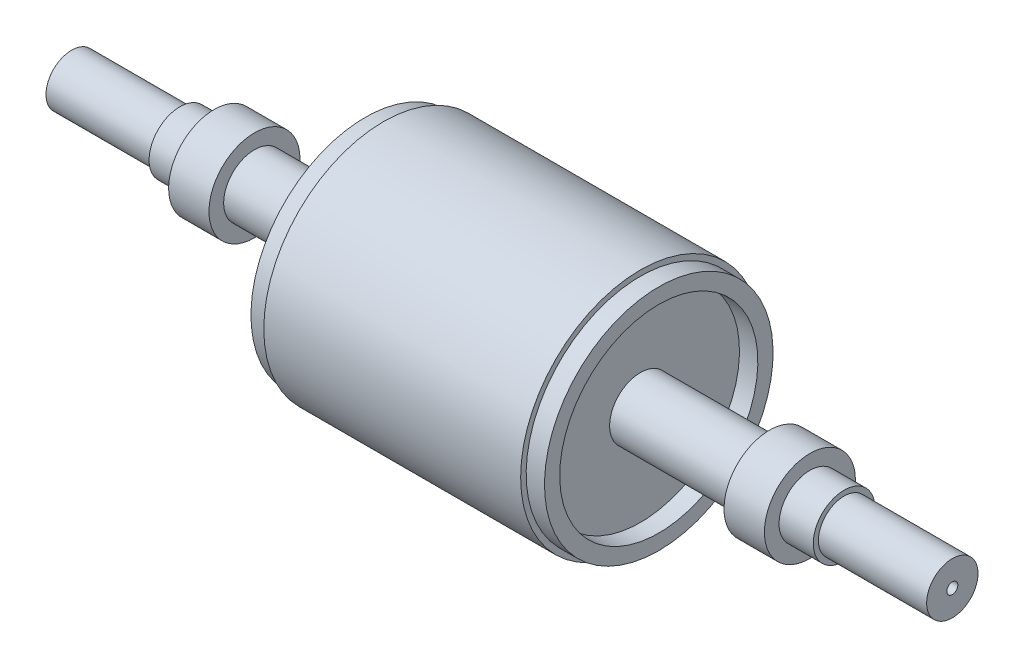
ISO-10303-21;
HEADER;
FILE_DESCRIPTION(('STEP AP214'),'2;1');
FILE_NAME('part.step','',(''),(''),'','','');
FILE_SCHEMA(('AUTOMOTIVE_DESIGN { 1 0 10303 214 1 1 1 1 }'));
ENDSEC;
DATA;
#1=APPLICATION_CONTEXT('core data for automotive mechanical design processes');
#2=APPLICATION_PROTOCOL_DEFINITION('international standard','automotive_design',2000,#1);
#3=PRODUCT_CONTEXT('',#1,'mechanical');
#4=PRODUCT('Part','Part','',(#3));
#5=PRODUCT_RELATED_PRODUCT_CATEGORY('part','',(#4));
#6=PRODUCT_DEFINITION_FORMATION('','',#4);
#7=PRODUCT_DEFINITION_CONTEXT('part definition',#1,'design');
#8=PRODUCT_DEFINITION('design','',#6,#7);
#9=PRODUCT_DEFINITION_SHAPE('','',#8);
#10=(LENGTH_UNIT() NAMED_UNIT(*) SI_UNIT(.MILLI.,.METRE.));
#11=(NAMED_UNIT(*) PLANE_ANGLE_UNIT() SI_UNIT($,.RADIAN.));
#12=(NAMED_UNIT(*) SI_UNIT($,.STERADIAN.) SOLID_ANGLE_UNIT());
#13=UNCERTAINTY_MEASURE_WITH_UNIT(LENGTH_MEASURE(1.E-05),#10,'distance_accuracy_value','');
#14=(GEOMETRIC_REPRESENTATION_CONTEXT(3) GLOBAL_UNCERTAINTY_ASSIGNED_CONTEXT((#13)) GLOBAL_UNIT_ASSIGNED_CONTEXT((#10,
#11,#12)) REPRESENTATION_CONTEXT('',''));
#15=CARTESIAN_POINT('',(0.,0.,0.));
#16=DIRECTION('',(0.,0.,1.));
#17=DIRECTION('',(1.,0.,0.));
#18=AXIS2_PLACEMENT_3D('',#15,#16,#17);
#19=CARTESIAN_POINT('',(95.4752231560291,0.,0.));
#20=DIRECTION('',(1.,0.,0.));
#21=DIRECTION('',(0.,1.,0.));
#22=AXIS2_PLACEMENT_3D('',#19,#20,#21);
#23=PLANE('',#22);
#24=CARTESIAN_POINT('',(95.4752231560291,-22.6944256888028,0.));
#25=DIRECTION('',(1.,0.,0.));
#26=DIRECTION('',(0.,1.,0.));
#27=AXIS2_PLACEMENT_3D('',#24,#25,#26);
#28=CIRCLE('',#27,27.);
#29=CARTESIAN_POINT('',(95.4752231560291,4.30557431119716,0.));
#30=VERTEX_POINT('',#29);
#31=EDGE_CURVE('E116',#30,#30,#28,.T.);
#32=ORIENTED_EDGE('',*,*,#31,.F.);
#33=EDGE_LOOP('',(#32));
#34=FACE_BOUND('',#33,.T.);
#35=CARTESIAN_POINT('',(95.4752231560291,-22.6944256888028,0.));
#36=DIRECTION('',(-1.,0.,0.));
#37=DIRECTION('',(0.,-1.,0.));
#38=AXIS2_PLACEMENT_3D('',#35,#36,#37);
#39=CIRCLE('',#38,31.1522029158007);
#40=CARTESIAN_POINT('',(95.4752231560291,-53.8466286046036,0.));
#41=VERTEX_POINT('',#40);
#42=EDGE_CURVE('E53',#41,#41,#39,.T.);
#43=ORIENTED_EDGE('',*,*,#42,.F.);
#44=EDGE_LOOP('',(#43));
#45=FACE_BOUND('',#44,.T.);
#46=ADVANCED_FACE('F38',(#34,#45),#23,.T.);
#47=CARTESIAN_POINT('',(95.4752231560291,-22.6944256888028,0.));
#48=DIRECTION('',(1.,0.,0.));
#49=DIRECTION('',(0.,1.,0.));
#50=AXIS2_PLACEMENT_3D('',#47,#48,#49);
#51=CONICAL_SURFACE('',#50,31.1522029158007,0.00169796264531494);
#52=CARTESIAN_POINT('',(90.4752303637203,-22.6944256888028,0.));
#53=DIRECTION('',(-1.,0.,0.));
#54=DIRECTION('',(0.,-1.,0.));
#55=AXIS2_PLACEMENT_3D('',#52,#53,#54);
#56=CIRCLE('',#55,31.1437131066536);
#57=CARTESIAN_POINT('',(90.4752303637203,-53.8381387954564,0.));
#58=VERTEX_POINT('',#57);
#59=EDGE_CURVE('E58',#58,#58,#56,.T.);
#60=ORIENTED_EDGE('',*,*,#59,.F.);
#61=EDGE_LOOP('',(#60));
#62=FACE_BOUND('',#61,.T.);
#63=ORIENTED_EDGE('',*,*,#42,.T.);
#64=EDGE_LOOP('',(#63));
#65=FACE_BOUND('',#64,.T.);
#66=ADVANCED_FACE('F166',(#62,#65),#51,.T.);
#67=CARTESIAN_POINT('',(90.4726834209761,-22.6944256888028,0.));
#68=DIRECTION('',(-1.,0.,0.));
#69=DIRECTION('',(0.,-1.,0.));
#70=AXIS2_PLACEMENT_3D('',#67,#68,#69);
#71=CONICAL_SURFACE('',#70,32.6437109443463,1.56909836414957);
#72=ORIENTED_EDGE('',*,*,#59,.T.);
#73=EDGE_LOOP('',(#72));
#74=FACE_BOUND('',#73,.T.);
#75=CARTESIAN_POINT('',(90.4726834209761,-22.6944256888028,0.));
#76=DIRECTION('',(-1.,0.,0.));
#77=DIRECTION('',(0.,-1.,0.));
#78=AXIS2_PLACEMENT_3D('',#75,#76,#77);
#79=CIRCLE('',#78,32.6437109443463);
#80=CARTESIAN_POINT('',(90.4726834209761,-55.3381366331491,0.));
#81=VERTEX_POINT('',#80);
#82=EDGE_CURVE('E61',#81,#81,#79,.T.);
#83=ORIENTED_EDGE('',*,*,#82,.F.);
#84=EDGE_LOOP('',(#83));
#85=FACE_BOUND('',#84,.T.);
#86=ADVANCED_FACE('F172',(#74,#85),#71,.T.);
#87=CARTESIAN_POINT('',(-64.5273165790239,-22.6944256888028,0.));
#88=DIRECTION('',(-1.,0.,0.));
#89=DIRECTION('',(0.,-1.,0.));
#90=AXIS2_PLACEMENT_3D('',#87,#88,#89);
#91=CYLINDRICAL_SURFACE('',#90,32.6437109443463);
#92=ORIENTED_EDGE('',*,*,#82,.T.);
#93=EDGE_LOOP('',(#92));
#94=FACE_BOUND('',#93,.T.);
#95=CARTESIAN_POINT('',(20.4726834209761,-22.6944256888028,0.));
#96=DIRECTION('',(-1.,0.,0.));
#97=DIRECTION('',(0.,-1.,0.));
#98=AXIS2_PLACEMENT_3D('',#95,#96,#97);
#99=CIRCLE('',#98,32.6437109443463);
#100=CARTESIAN_POINT('',(20.4726834209761,-55.3381366331491,0.));
#101=VERTEX_POINT('',#100);
#102=EDGE_CURVE('E64',#101,#101,#99,.T.);
#103=ORIENTED_EDGE('',*,*,#102,.F.);
#104=EDGE_LOOP('',(#103));
#105=FACE_BOUND('',#104,.T.);
#106=ADVANCED_FACE('F276',(#94,#105),#91,.T.);
#107=CARTESIAN_POINT('',(20.4726834209761,0.,0.));
#108=DIRECTION('',(1.,0.,0.));
#109=DIRECTION('',(0.,1.,0.));
#110=AXIS2_PLACEMENT_3D('',#107,#108,#109);
#111=PLANE('',#110);
#112=CARTESIAN_POINT('',(20.4726834209761,-22.6944256888028,0.));
#113=DIRECTION('',(-1.,0.,0.));
#114=DIRECTION('',(0.,-1.,0.));
#115=AXIS2_PLACEMENT_3D('',#112,#113,#114);
#116=CIRCLE('',#115,31.1437109443463);
#117=CARTESIAN_POINT('',(20.4726834209761,-53.8381366331491,0.));
#118=VERTEX_POINT('',#117);
#119=EDGE_CURVE('E67',#118,#118,#116,.T.);
#120=ORIENTED_EDGE('',*,*,#119,.F.);
#121=EDGE_LOOP('',(#120));
#122=FACE_BOUND('',#121,.T.);
#123=ORIENTED_EDGE('',*,*,#102,.T.);
#124=EDGE_LOOP('',(#123));
#125=FACE_BOUND('',#124,.T.);
#126=ADVANCED_FACE('F286',(#122,#125),#111,.F.);
#127=CARTESIAN_POINT('',(-64.5273165790239,-22.6944256888028,0.));
#128=DIRECTION('',(-1.,0.,0.));
#129=DIRECTION('',(0.,-1.,0.));
#130=AXIS2_PLACEMENT_3D('',#127,#128,#129);
#131=CYLINDRICAL_SURFACE('',#130,31.1437109443463);
#132=ORIENTED_EDGE('',*,*,#119,.T.);
#133=EDGE_LOOP('',(#132));
#134=FACE_BOUND('',#133,.T.);
#135=CARTESIAN_POINT('',(15.4726834209761,-22.6944256888028,0.));
#136=DIRECTION('',(-1.,0.,0.));
#137=DIRECTION('',(0.,-1.,0.));
#138=AXIS2_PLACEMENT_3D('',#135,#136,#137);
#139=CIRCLE('',#138,31.1437109443463);
#140=CARTESIAN_POINT('',(15.4726834209761,-53.8381366331491,0.));
#141=VERTEX_POINT('',#140);
#142=EDGE_CURVE('E70',#141,#141,#139,.T.);
#143=ORIENTED_EDGE('',*,*,#142,.F.);
#144=EDGE_LOOP('',(#143));
#145=FACE_BOUND('',#144,.T.);
#146=ADVANCED_FACE('F297',(#134,#145),#131,.T.);
#147=CARTESIAN_POINT('',(15.4726834209761,0.,0.));
#148=DIRECTION('',(1.,0.,0.));
#149=DIRECTION('',(0.,1.,0.));
#150=AXIS2_PLACEMENT_3D('',#147,#148,#149);
#151=PLANE('',#150);
#152=CARTESIAN_POINT('',(15.4726834209761,-22.6944256888028,0.));
#153=DIRECTION('',(-1.,0.,0.));
#154=DIRECTION('',(0.,-1.,0.));
#155=AXIS2_PLACEMENT_3D('',#152,#153,#154);
#156=CIRCLE('',#155,27.);
#157=CARTESIAN_POINT('',(15.4726834209761,-49.6944256888028,0.));
#158=VERTEX_POINT('',#157);
#159=EDGE_CURVE('E107',#158,#158,#156,.T.);
#160=ORIENTED_EDGE('',*,*,#159,.F.);
#161=EDGE_LOOP('',(#160));
#162=FACE_BOUND('',#161,.T.);
#163=ORIENTED_EDGE('',*,*,#142,.T.);
#164=EDGE_LOOP('',(#163));
#165=FACE_BOUND('',#164,.T.);
#166=ADVANCED_FACE('F209',(#162,#165),#151,.F.);
#167=CARTESIAN_POINT('',(20.4726834209761,-22.6944256888028,0.));
#168=DIRECTION('',(-1.,0.,0.));
#169=DIRECTION('',(0.,-1.,0.));
#170=AXIS2_PLACEMENT_3D('',#167,#168,#169);
#171=CYLINDRICAL_SURFACE('',#170,27.);
#172=CARTESIAN_POINT('',(20.4726834209761,-22.6944256888028,0.));
#173=DIRECTION('',(-1.,0.,0.));
#174=DIRECTION('',(0.,-1.,0.));
#175=AXIS2_PLACEMENT_3D('',#172,#173,#174);
#176=CIRCLE('',#175,27.);
#177=CARTESIAN_POINT('',(20.4726834209761,-49.6944256888028,0.));
#178=VERTEX_POINT('',#177);
#179=EDGE_CURVE('E106',#178,#178,#176,.T.);
#180=ORIENTED_EDGE('',*,*,#179,.F.);
#181=EDGE_LOOP('',(#180));
#182=FACE_BOUND('',#181,.T.);
#183=ORIENTED_EDGE('',*,*,#159,.T.);
#184=EDGE_LOOP('',(#183));
#185=FACE_BOUND('',#184,.T.);
#186=ADVANCED_FACE('F205',(#182,#185),#171,.F.);
#187=CARTESIAN_POINT('',(20.4726834209761,-22.6944256888028,0.));
#188=DIRECTION('',(-1.,0.,0.));
#189=DIRECTION('',(0.,-1.,0.));
#190=AXIS2_PLACEMENT_3D('',#187,#188,#189);
#191=PLANE('',#190);
#192=CARTESIAN_POINT('',(20.4726834209761,-22.6944256888028,0.));
#193=DIRECTION('',(-1.,0.,0.));
#194=DIRECTION('',(0.,-1.,0.));
#195=AXIS2_PLACEMENT_3D('',#192,#193,#194);
#196=CIRCLE('',#195,8.4);
#197=CARTESIAN_POINT('',(20.4726834209761,-31.0944256888028,0.));
#198=VERTEX_POINT('',#197);
#199=EDGE_CURVE('E110',#198,#198,#196,.T.);
#200=ORIENTED_EDGE('',*,*,#199,.F.);
#201=EDGE_LOOP('',(#200));
#202=FACE_BOUND('',#201,.T.);
#203=ORIENTED_EDGE('',*,*,#179,.T.);
#204=EDGE_LOOP('',(#203));
#205=FACE_BOUND('',#204,.T.);
#206=ADVANCED_FACE('F208',(#202,#205),#191,.T.);
#207=CARTESIAN_POINT('',(-64.5273165790239,1.2792805818448E-13,0.));
#208=DIRECTION('',(1.,0.,0.));
#209=DIRECTION('',(0.,1.,0.));
#210=AXIS2_PLACEMENT_3D('',#207,#208,#209);
#211=PLANE('',#210);
#212=CARTESIAN_POINT('',(-64.5273165790239,-22.6944256888028,0.));
#213=DIRECTION('',(-1.,0.,0.));
#214=DIRECTION('',(0.,-1.,0.));
#215=AXIS2_PLACEMENT_3D('',#212,#213,#214);
#216=CIRCLE('',#215,1.5);
#217=CARTESIAN_POINT('',(-64.5273165790239,-24.1944256888028,0.));
#218=VERTEX_POINT('',#217);
#219=EDGE_CURVE('E125',#218,#218,#216,.T.);
#220=ORIENTED_EDGE('',*,*,#219,.F.);
#221=EDGE_LOOP('',(#220));
#222=FACE_BOUND('',#221,.T.);
#223=CARTESIAN_POINT('',(-64.5273165790239,-22.6944256888028,0.));
#224=DIRECTION('',(-1.,0.,0.));
#225=DIRECTION('',(0.,-1.,0.));
#226=AXIS2_PLACEMENT_3D('',#223,#224,#225);
#227=CIRCLE('',#226,7.);
#228=CARTESIAN_POINT('',(-64.5273165790239,-29.6944256888028,0.));
#229=VERTEX_POINT('',#228);
#230=EDGE_CURVE('E91',#229,#229,#227,.T.);
#231=ORIENTED_EDGE('',*,*,#230,.T.);
#232=EDGE_LOOP('',(#231));
#233=FACE_BOUND('',#232,.T.);
#234=ADVANCED_FACE('F213',(#222,#233),#211,.F.);
#235=CARTESIAN_POINT('',(-64.5273165790239,-22.6944256888028,0.));
#236=DIRECTION('',(-1.,0.,0.));
#237=DIRECTION('',(0.,-1.,0.));
#238=AXIS2_PLACEMENT_3D('',#235,#236,#237);
#239=CYLINDRICAL_SURFACE('',#238,7.);
#240=CARTESIAN_POINT('',(-35.0273165790239,-22.6944256888028,0.));
#241=DIRECTION('',(-1.,0.,0.));
#242=DIRECTION('',(0.,-1.,0.));
#243=AXIS2_PLACEMENT_3D('',#240,#241,#242);
#244=CIRCLE('',#243,7.);
#245=CARTESIAN_POINT('',(-35.0273165790239,-29.6944256888028,0.));
#246=VERTEX_POINT('',#245);
#247=EDGE_CURVE('E88',#246,#246,#244,.T.);
#248=ORIENTED_EDGE('',*,*,#247,.T.);
#249=EDGE_LOOP('',(#248));
#250=FACE_BOUND('',#249,.T.);
#251=ORIENTED_EDGE('',*,*,#230,.F.);
#252=EDGE_LOOP('',(#251));
#253=FACE_BOUND('',#252,.T.);
#254=ADVANCED_FACE('F367',(#250,#253),#239,.T.);
#255=CARTESIAN_POINT('',(-35.0273165790239,0.,0.));
#256=DIRECTION('',(1.,0.,0.));
#257=DIRECTION('',(0.,1.,0.));
#258=AXIS2_PLACEMENT_3D('',#255,#256,#257);
#259=PLANE('',#258);
#260=ORIENTED_EDGE('',*,*,#247,.F.);
#261=EDGE_LOOP('',(#260));
#262=FACE_BOUND('',#261,.T.);
#263=CARTESIAN_POINT('',(-35.0273165790239,-22.6944256888028,0.));
#264=DIRECTION('',(-1.,0.,0.));
#265=DIRECTION('',(0.,-1.,0.));
#266=AXIS2_PLACEMENT_3D('',#263,#264,#265);
#267=CIRCLE('',#266,8.4);
#268=CARTESIAN_POINT('',(-35.0273165790239,-31.0944256888028,0.));
#269=VERTEX_POINT('',#268);
#270=EDGE_CURVE('E85',#269,#269,#267,.T.);
#271=ORIENTED_EDGE('',*,*,#270,.T.);
#272=EDGE_LOOP('',(#271));
#273=FACE_BOUND('',#272,.T.);
#274=ADVANCED_FACE('F356',(#262,#273),#259,.F.);
#275=CARTESIAN_POINT('',(-64.5273165790239,-22.6944256888028,0.));
#276=DIRECTION('',(-1.,0.,0.));
#277=DIRECTION('',(0.,-1.,0.));
#278=AXIS2_PLACEMENT_3D('',#275,#276,#277);
#279=CYLINDRICAL_SURFACE('',#278,8.4);
#280=ORIENTED_EDGE('',*,*,#270,.F.);
#281=EDGE_LOOP('',(#280));
#282=FACE_BOUND('',#281,.T.);
#283=CARTESIAN_POINT('',(-25.7073165790239,-22.6944256888028,0.));
#284=DIRECTION('',(-1.,0.,0.));
#285=DIRECTION('',(0.,-1.,0.));
#286=AXIS2_PLACEMENT_3D('',#283,#284,#285);
#287=CIRCLE('',#286,8.4);
#288=CARTESIAN_POINT('',(-25.7073165790239,-31.0944256888028,0.));
#289=VERTEX_POINT('',#288);
#290=EDGE_CURVE('E82',#289,#289,#287,.T.);
#291=ORIENTED_EDGE('',*,*,#290,.T.);
#292=EDGE_LOOP('',(#291));
#293=FACE_BOUND('',#292,.T.);
#294=ADVANCED_FACE('F345',(#282,#293),#279,.T.);
#295=CARTESIAN_POINT('',(-25.7073165790239,0.,0.));
#296=DIRECTION('',(1.,0.,0.));
#297=DIRECTION('',(0.,1.,0.));
#298=AXIS2_PLACEMENT_3D('',#295,#296,#297);
#299=PLANE('',#298);
#300=ORIENTED_EDGE('',*,*,#290,.F.);
#301=EDGE_LOOP('',(#300));
#302=FACE_BOUND('',#301,.T.);
#303=CARTESIAN_POINT('',(-25.7073165790239,-22.6944256888028,0.));
#304=DIRECTION('',(-1.,0.,0.));
#305=DIRECTION('',(0.,-1.,0.));
#306=AXIS2_PLACEMENT_3D('',#303,#304,#305);
#307=CIRCLE('',#306,12.4);
#308=CARTESIAN_POINT('',(-25.7073165790239,-35.0944256888028,0.));
#309=VERTEX_POINT('',#308);
#310=EDGE_CURVE('E79',#309,#309,#307,.T.);
#311=ORIENTED_EDGE('',*,*,#310,.T.);
#312=EDGE_LOOP('',(#311));
#313=FACE_BOUND('',#312,.T.);
#314=ADVANCED_FACE('F334',(#302,#313),#299,.F.);
#315=CARTESIAN_POINT('',(-64.5273165790239,-22.6944256888028,0.));
#316=DIRECTION('',(-1.,0.,0.));
#317=DIRECTION('',(0.,-1.,0.));
#318=AXIS2_PLACEMENT_3D('',#315,#316,#317);
#319=CYLINDRICAL_SURFACE('',#318,12.4);
#320=CARTESIAN_POINT('',(-14.7073165790239,-22.6944256888028,0.));
#321=DIRECTION('',(-1.,0.,0.));
#322=DIRECTION('',(0.,-1.,0.));
#323=AXIS2_PLACEMENT_3D('',#320,#321,#322);
#324=CIRCLE('',#323,12.4);
#325=CARTESIAN_POINT('',(-14.7073165790239,-35.0944256888028,0.));
#326=VERTEX_POINT('',#325);
#327=EDGE_CURVE('E76',#326,#326,#324,.T.);
#328=ORIENTED_EDGE('',*,*,#327,.T.);
#329=EDGE_LOOP('',(#328));
#330=FACE_BOUND('',#329,.T.);
#331=ORIENTED_EDGE('',*,*,#310,.F.);
#332=EDGE_LOOP('',(#331));
#333=FACE_BOUND('',#332,.T.);
#334=ADVANCED_FACE('F321',(#330,#333),#319,.T.);
#335=CARTESIAN_POINT('',(-14.7073165790239,0.,0.));
#336=DIRECTION('',(1.,0.,0.));
#337=DIRECTION('',(0.,1.,0.));
#338=AXIS2_PLACEMENT_3D('',#335,#336,#337);
#339=PLANE('',#338);
#340=CARTESIAN_POINT('',(-14.7073165790239,-22.6944256888028,0.));
#341=DIRECTION('',(-1.,0.,0.));
#342=DIRECTION('',(0.,-1.,0.));
#343=AXIS2_PLACEMENT_3D('',#340,#341,#342);
#344=CIRCLE('',#343,8.4);
#345=CARTESIAN_POINT('',(-14.7073165790239,-31.0944256888028,0.));
#346=VERTEX_POINT('',#345);
#347=EDGE_CURVE('E73',#346,#346,#344,.T.);
#348=ORIENTED_EDGE('',*,*,#347,.T.);
#349=EDGE_LOOP('',(#348));
#350=FACE_BOUND('',#349,.T.);
#351=ORIENTED_EDGE('',*,*,#327,.F.);
#352=EDGE_LOOP('',(#351));
#353=FACE_BOUND('',#352,.T.);
#354=ADVANCED_FACE('F316',(#350,#353),#339,.T.);
#355=CARTESIAN_POINT('',(-64.5273165790239,-22.6944256888028,0.));
#356=DIRECTION('',(-1.,0.,0.));
#357=DIRECTION('',(0.,-1.,0.));
#358=AXIS2_PLACEMENT_3D('',#355,#356,#357);
#359=CYLINDRICAL_SURFACE('',#358,8.4);
#360=ORIENTED_EDGE('',*,*,#347,.F.);
#361=EDGE_LOOP('',(#360));
#362=FACE_BOUND('',#361,.T.);
#363=ORIENTED_EDGE('',*,*,#199,.T.);
#364=EDGE_LOOP('',(#363));
#365=FACE_BOUND('',#364,.T.);
#366=ADVANCED_FACE('F218',(#362,#365),#359,.T.);
#367=CARTESIAN_POINT('',(90.4752231560291,-22.6944256888028,0.));
#368=DIRECTION('',(1.,0.,0.));
#369=DIRECTION('',(0.,1.,0.));
#370=AXIS2_PLACEMENT_3D('',#367,#368,#369);
#371=CYLINDRICAL_SURFACE('',#370,27.);
#372=CARTESIAN_POINT('',(90.4752231560291,-22.6944256888028,0.));
#373=DIRECTION('',(1.,0.,0.));
#374=DIRECTION('',(0.,1.,0.));
#375=AXIS2_PLACEMENT_3D('',#372,#373,#374);
#376=CIRCLE('',#375,27.);
#377=CARTESIAN_POINT('',(90.4752231560291,4.30557431119716,0.));
#378=VERTEX_POINT('',#377);
#379=EDGE_CURVE('E115',#378,#378,#376,.T.);
#380=ORIENTED_EDGE('',*,*,#379,.F.);
#381=EDGE_LOOP('',(#380));
#382=FACE_BOUND('',#381,.T.);
#383=ORIENTED_EDGE('',*,*,#31,.T.);
#384=EDGE_LOOP('',(#383));
#385=FACE_BOUND('',#384,.T.);
#386=ADVANCED_FACE('F215',(#382,#385),#371,.F.);
#387=CARTESIAN_POINT('',(90.4752231560291,-22.6944256888028,0.));
#388=DIRECTION('',(1.,0.,0.));
#389=DIRECTION('',(0.,1.,0.));
#390=AXIS2_PLACEMENT_3D('',#387,#388,#389);
#391=PLANE('',#390);
#392=CARTESIAN_POINT('',(90.4752231560291,-22.6944256888028,0.));
#393=DIRECTION('',(1.,0.,0.));
#394=DIRECTION('',(0.,1.,0.));
#395=AXIS2_PLACEMENT_3D('',#392,#393,#394);
#396=CIRCLE('',#395,8.4);
#397=CARTESIAN_POINT('',(90.4752231560291,-14.2944256888028,0.));
#398=VERTEX_POINT('',#397);
#399=EDGE_CURVE('E119',#398,#398,#396,.T.);
#400=ORIENTED_EDGE('',*,*,#399,.F.);
#401=EDGE_LOOP('',(#400));
#402=FACE_BOUND('',#401,.T.);
#403=ORIENTED_EDGE('',*,*,#379,.T.);
#404=EDGE_LOOP('',(#403));
#405=FACE_BOUND('',#404,.T.);
#406=ADVANCED_FACE('F150',(#402,#405),#391,.T.);
#407=CARTESIAN_POINT('',(175.475223156029,6.95773689282361E-13,0.));
#408=DIRECTION('',(-1.,0.,0.));
#409=DIRECTION('',(0.,-1.,0.));
#410=AXIS2_PLACEMENT_3D('',#407,#408,#409);
#411=PLANE('',#410);
#412=CARTESIAN_POINT('',(175.475223156029,-22.6944256888028,0.));
#413=DIRECTION('',(1.,0.,0.));
#414=DIRECTION('',(0.,1.,0.));
#415=AXIS2_PLACEMENT_3D('',#412,#413,#414);
#416=CIRCLE('',#415,1.5);
#417=CARTESIAN_POINT('',(175.475223156029,-21.1944256888028,0.));
#418=VERTEX_POINT('',#417);
#419=EDGE_CURVE('E131',#418,#418,#416,.T.);
#420=ORIENTED_EDGE('',*,*,#419,.F.);
#421=EDGE_LOOP('',(#420));
#422=FACE_BOUND('',#421,.T.);
#423=CARTESIAN_POINT('',(175.475223156029,-22.6944256888028,0.));
#424=DIRECTION('',(-1.,0.,0.));
#425=DIRECTION('',(0.,-1.,0.));
#426=AXIS2_PLACEMENT_3D('',#423,#424,#425);
#427=CIRCLE('',#426,7.);
#428=CARTESIAN_POINT('',(175.475223156029,-29.6944256888028,0.));
#429=VERTEX_POINT('',#428);
#430=EDGE_CURVE('E94',#429,#429,#427,.T.);
#431=ORIENTED_EDGE('',*,*,#430,.F.);
#432=EDGE_LOOP('',(#431));
#433=FACE_BOUND('',#432,.T.);
#434=ADVANCED_FACE('F146',(#422,#433),#411,.F.);
#435=CARTESIAN_POINT('',(-64.5273165790239,-22.6944256888028,0.));
#436=DIRECTION('',(-1.,0.,0.));
#437=DIRECTION('',(0.,-1.,0.));
#438=AXIS2_PLACEMENT_3D('',#435,#436,#437);
#439=CYLINDRICAL_SURFACE('',#438,7.);
#440=CARTESIAN_POINT('',(145.975223156029,-22.6944256888028,0.));
#441=DIRECTION('',(-1.,0.,0.));
#442=DIRECTION('',(0.,-1.,0.));
#443=AXIS2_PLACEMENT_3D('',#440,#441,#442);
#444=CIRCLE('',#443,7.);
#445=CARTESIAN_POINT('',(145.975223156029,-29.6944256888028,0.));
#446=VERTEX_POINT('',#445);
#447=EDGE_CURVE('E97',#446,#446,#444,.T.);
#448=ORIENTED_EDGE('',*,*,#447,.F.);
#449=EDGE_LOOP('',(#448));
#450=FACE_BOUND('',#449,.T.);
#451=ORIENTED_EDGE('',*,*,#430,.T.);
#452=EDGE_LOOP('',(#451));
#453=FACE_BOUND('',#452,.T.);
#454=ADVANCED_FACE('F149',(#450,#453),#439,.T.);
#455=CARTESIAN_POINT('',(145.975223156029,0.,0.));
#456=DIRECTION('',(1.,0.,0.));
#457=DIRECTION('',(0.,1.,0.));
#458=AXIS2_PLACEMENT_3D('',#455,#456,#457);
#459=PLANE('',#458);
#460=ORIENTED_EDGE('',*,*,#447,.T.);
#461=EDGE_LOOP('',(#460));
#462=FACE_BOUND('',#461,.T.);
#463=CARTESIAN_POINT('',(145.975223156029,-22.6944256888028,0.));
#464=DIRECTION('',(-1.,0.,0.));
#465=DIRECTION('',(0.,-1.,0.));
#466=AXIS2_PLACEMENT_3D('',#463,#464,#465);
#467=CIRCLE('',#466,8.4);
#468=CARTESIAN_POINT('',(145.975223156029,-31.0944256888028,0.));
#469=VERTEX_POINT('',#468);
#470=EDGE_CURVE('E100',#469,#469,#467,.T.);
#471=ORIENTED_EDGE('',*,*,#470,.F.);
#472=EDGE_LOOP('',(#471));
#473=FACE_BOUND('',#472,.T.);
#474=ADVANCED_FACE('F155',(#462,#473),#459,.T.);
#475=CARTESIAN_POINT('',(-64.5273165790239,-22.6944256888028,0.));
#476=DIRECTION('',(-1.,0.,0.));
#477=DIRECTION('',(0.,-1.,0.));
#478=AXIS2_PLACEMENT_3D('',#475,#476,#477);
#479=CYLINDRICAL_SURFACE('',#478,8.4);
#480=ORIENTED_EDGE('',*,*,#470,.T.);
#481=EDGE_LOOP('',(#480));
#482=FACE_BOUND('',#481,.T.);
#483=CARTESIAN_POINT('',(136.652683420976,-22.6944256888028,0.));
#484=DIRECTION('',(-1.,0.,0.));
#485=DIRECTION('',(0.,-1.,0.));
#486=AXIS2_PLACEMENT_3D('',#483,#484,#485);
#487=CIRCLE('',#486,8.4);
#488=CARTESIAN_POINT('',(136.652683420976,-31.0944256888028,0.));
#489=VERTEX_POINT('',#488);
#490=EDGE_CURVE('E103',#489,#489,#487,.T.);
#491=ORIENTED_EDGE('',*,*,#490,.F.);
#492=EDGE_LOOP('',(#491));
#493=FACE_BOUND('',#492,.T.);
#494=ADVANCED_FACE('F161',(#482,#493),#479,.T.);
#495=CARTESIAN_POINT('',(136.652683420976,0.,0.));
#496=DIRECTION('',(1.,0.,0.));
#497=DIRECTION('',(0.,1.,0.));
#498=AXIS2_PLACEMENT_3D('',#495,#496,#497);
#499=PLANE('',#498);
#500=ORIENTED_EDGE('',*,*,#490,.T.);
#501=EDGE_LOOP('',(#500));
#502=FACE_BOUND('',#501,.T.);
#503=CARTESIAN_POINT('',(136.652683420976,-22.6944256888028,0.));
#504=DIRECTION('',(-1.,0.,0.));
#505=DIRECTION('',(0.,-1.,0.));
#506=AXIS2_PLACEMENT_3D('',#503,#504,#505);
#507=CIRCLE('',#506,12.4);
#508=CARTESIAN_POINT('',(136.652683420976,-35.0944256888028,0.));
#509=VERTEX_POINT('',#508);
#510=EDGE_CURVE('E10',#509,#509,#507,.T.);
#511=ORIENTED_EDGE('',*,*,#510,.F.);
#512=EDGE_LOOP('',(#511));
#513=FACE_BOUND('',#512,.T.);
#514=ADVANCED_FACE('F40',(#502,#513),#499,.T.);
#515=CARTESIAN_POINT('',(-64.5273165790239,-22.6944256888028,0.));
#516=DIRECTION('',(-1.,0.,0.));
#517=DIRECTION('',(0.,-1.,0.));
#518=AXIS2_PLACEMENT_3D('',#515,#516,#517);
#519=CYLINDRICAL_SURFACE('',#518,12.4);
#520=ORIENTED_EDGE('',*,*,#510,.T.);
#521=EDGE_LOOP('',(#520));
#522=FACE_BOUND('',#521,.T.);
#523=CARTESIAN_POINT('',(125.652683420976,-22.6944256888028,0.));
#524=DIRECTION('',(-1.,0.,0.));
#525=DIRECTION('',(0.,-1.,0.));
#526=AXIS2_PLACEMENT_3D('',#523,#524,#525);
#527=CIRCLE('',#526,12.4);
#528=CARTESIAN_POINT('',(125.652683420976,-35.0944256888028,0.));
#529=VERTEX_POINT('',#528);
#530=EDGE_CURVE('E45',#529,#529,#527,.T.);
#531=ORIENTED_EDGE('',*,*,#530,.F.);
#532=EDGE_LOOP('',(#531));
#533=FACE_BOUND('',#532,.T.);
#534=ADVANCED_FACE('F186',(#522,#533),#519,.T.);
#535=CARTESIAN_POINT('',(125.652683420976,-8.71890638999397E-13,0.));
#536=DIRECTION('',(1.,0.,0.));
#537=DIRECTION('',(0.,1.,0.));
#538=AXIS2_PLACEMENT_3D('',#535,#536,#537);
#539=PLANE('',#538);
#540=CARTESIAN_POINT('',(125.652683420976,-22.6944256888028,0.));
#541=DIRECTION('',(-1.,0.,0.));
#542=DIRECTION('',(0.,-1.,0.));
#543=AXIS2_PLACEMENT_3D('',#540,#541,#542);
#544=CIRCLE('',#543,8.4);
#545=CARTESIAN_POINT('',(125.652683420976,-31.0944256888028,0.));
#546=VERTEX_POINT('',#545);
#547=EDGE_CURVE('E49',#546,#546,#544,.T.);
#548=ORIENTED_EDGE('',*,*,#547,.F.);
#549=EDGE_LOOP('',(#548));
#550=FACE_BOUND('',#549,.T.);
#551=ORIENTED_EDGE('',*,*,#530,.T.);
#552=EDGE_LOOP('',(#551));
#553=FACE_BOUND('',#552,.T.);
#554=ADVANCED_FACE('F183',(#550,#553),#539,.F.);
#555=CARTESIAN_POINT('',(-64.5273165790239,-22.6944256888028,0.));
#556=DIRECTION('',(-1.,0.,0.));
#557=DIRECTION('',(0.,-1.,0.));
#558=AXIS2_PLACEMENT_3D('',#555,#556,#557);
#559=CYLINDRICAL_SURFACE('',#558,8.4);
#560=ORIENTED_EDGE('',*,*,#547,.T.);
#561=EDGE_LOOP('',(#560));
#562=FACE_BOUND('',#561,.T.);
#563=ORIENTED_EDGE('',*,*,#399,.T.);
#564=EDGE_LOOP('',(#563));
#565=FACE_BOUND('',#564,.T.);
#566=ADVANCED_FACE('F179',(#562,#565),#559,.T.);
#567=CARTESIAN_POINT('',(-59.5273165790239,-22.6944256888028,0.));
#568=DIRECTION('',(-1.,0.,0.));
#569=DIRECTION('',(0.,-1.,0.));
#570=AXIS2_PLACEMENT_3D('',#567,#568,#569);
#571=CYLINDRICAL_SURFACE('',#570,1.5);
#572=CARTESIAN_POINT('',(-59.5273165790239,-22.6944256888028,0.));
#573=DIRECTION('',(-1.,0.,0.));
#574=DIRECTION('',(0.,-1.,0.));
#575=AXIS2_PLACEMENT_3D('',#572,#573,#574);
#576=CIRCLE('',#575,1.5);
#577=CARTESIAN_POINT('',(-59.5273165790239,-24.1944256888028,0.));
#578=VERTEX_POINT('',#577);
#579=EDGE_CURVE('E124',#578,#578,#576,.T.);
#580=ORIENTED_EDGE('',*,*,#579,.F.);
#581=EDGE_LOOP('',(#580));
#582=FACE_BOUND('',#581,.T.);
#583=ORIENTED_EDGE('',*,*,#219,.T.);
#584=EDGE_LOOP('',(#583));
#585=FACE_BOUND('',#584,.T.);
#586=ADVANCED_FACE('F182',(#582,#585),#571,.F.);
#587=CARTESIAN_POINT('',(-59.5273165790239,-22.6944256888028,0.));
#588=DIRECTION('',(-1.,0.,0.));
#589=DIRECTION('',(0.,-1.,0.));
#590=AXIS2_PLACEMENT_3D('',#587,#588,#589);
#591=PLANE('',#590);
#592=ORIENTED_EDGE('',*,*,#579,.T.);
#593=EDGE_LOOP('',(#592));
#594=FACE_BOUND('',#593,.T.);
#595=ADVANCED_FACE('F142',(#594),#591,.T.);
#596=CARTESIAN_POINT('',(170.475223156029,-22.6944256888028,0.));
#597=DIRECTION('',(1.,0.,0.));
#598=DIRECTION('',(0.,1.,0.));
#599=AXIS2_PLACEMENT_3D('',#596,#597,#598);
#600=CYLINDRICAL_SURFACE('',#599,1.5);
#601=CARTESIAN_POINT('',(170.475223156029,-22.6944256888028,0.));
#602=DIRECTION('',(1.,0.,0.));
#603=DIRECTION('',(0.,1.,0.));
#604=AXIS2_PLACEMENT_3D('',#601,#602,#603);
#605=CIRCLE('',#604,1.5);
#606=CARTESIAN_POINT('',(170.475223156029,-21.1944256888028,0.));
#607=VERTEX_POINT('',#606);
#608=EDGE_CURVE('E128',#607,#607,#605,.T.);
#609=ORIENTED_EDGE('',*,*,#608,.F.);
#610=EDGE_LOOP('',(#609));
#611=FACE_BOUND('',#610,.T.);
#612=ORIENTED_EDGE('',*,*,#419,.T.);
#613=EDGE_LOOP('',(#612));
#614=FACE_BOUND('',#613,.T.);
#615=ADVANCED_FACE('F139',(#611,#614),#600,.F.);
#616=CARTESIAN_POINT('',(170.475223156029,-22.6944256888028,0.));
#617=DIRECTION('',(1.,0.,0.));
#618=DIRECTION('',(0.,1.,0.));
#619=AXIS2_PLACEMENT_3D('',#616,#617,#618);
#620=PLANE('',#619);
#621=ORIENTED_EDGE('',*,*,#608,.T.);
#622=EDGE_LOOP('',(#621));
#623=FACE_BOUND('',#622,.T.);
#624=ADVANCED_FACE('F137',(#623),#620,.T.);
#625=CLOSED_SHELL('',(#46,#66,#86,#106,#126,#146,#166,#186,#206,#234,#254,#274,#294,#314,#334,
#354,#366,#386,#406,#434,#454,#474,#494,#514,#534,#554,#566,#586,#595,#615,#624));
#626=MANIFOLD_SOLID_BREP('B2',#625);
#627=ADVANCED_BREP_SHAPE_REPRESENTATION('',(#18,#626),#14);
#628=SHAPE_DEFINITION_REPRESENTATION(#9,#627);
ENDSEC;
END-ISO-10303-21;
